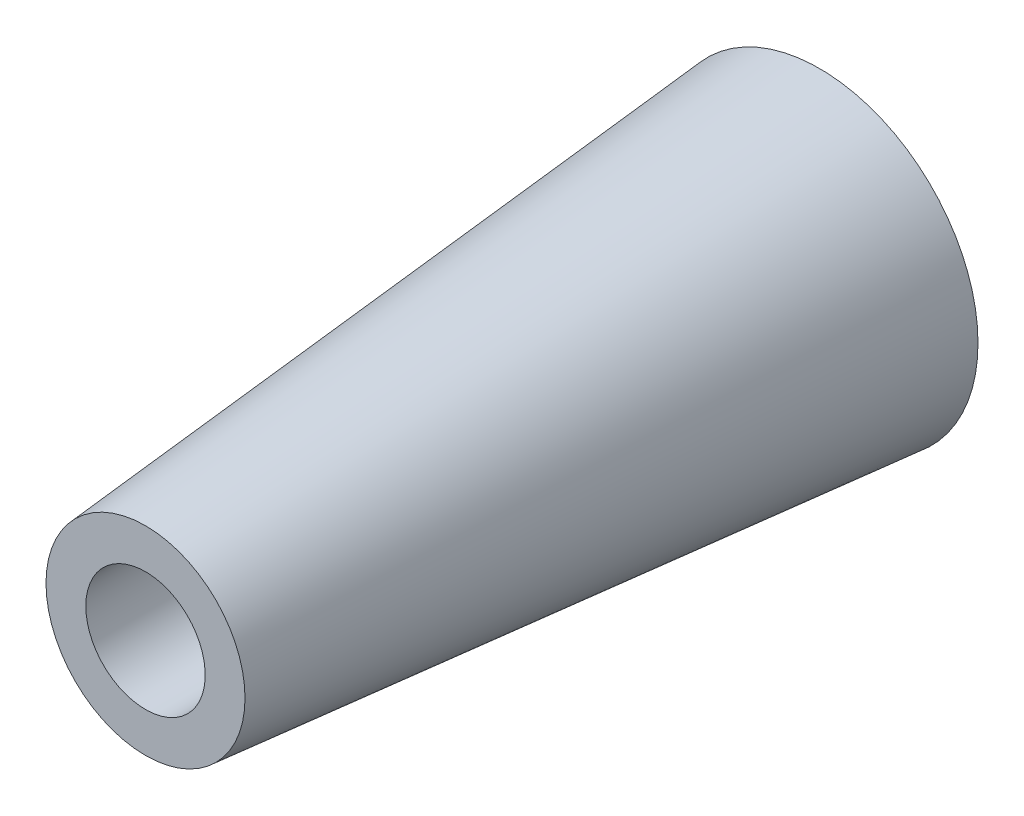
ISO-10303-21;
HEADER;
FILE_DESCRIPTION(('STEP AP214'),'2;1');
FILE_NAME('part.step','',(''),(''),'','','');
FILE_SCHEMA(('AUTOMOTIVE_DESIGN { 1 0 10303 214 1 1 1 1 }'));
ENDSEC;
DATA;
#1=APPLICATION_CONTEXT('core data for automotive mechanical design processes');
#2=APPLICATION_PROTOCOL_DEFINITION('international standard','automotive_design',2000,#1);
#3=PRODUCT_CONTEXT('',#1,'mechanical');
#4=PRODUCT('Part','Part','',(#3));
#5=PRODUCT_RELATED_PRODUCT_CATEGORY('part','',(#4));
#6=PRODUCT_DEFINITION_FORMATION('','',#4);
#7=PRODUCT_DEFINITION_CONTEXT('part definition',#1,'design');
#8=PRODUCT_DEFINITION('design','',#6,#7);
#9=PRODUCT_DEFINITION_SHAPE('','',#8);
#10=(LENGTH_UNIT() NAMED_UNIT(*) SI_UNIT(.MILLI.,.METRE.));
#11=(NAMED_UNIT(*) PLANE_ANGLE_UNIT() SI_UNIT($,.RADIAN.));
#12=(NAMED_UNIT(*) SI_UNIT($,.STERADIAN.) SOLID_ANGLE_UNIT());
#13=UNCERTAINTY_MEASURE_WITH_UNIT(LENGTH_MEASURE(1.E-05),#10,'distance_accuracy_value','');
#14=(GEOMETRIC_REPRESENTATION_CONTEXT(3) GLOBAL_UNCERTAINTY_ASSIGNED_CONTEXT((#13)) GLOBAL_UNIT_ASSIGNED_CONTEXT((#10,
#11,#12)) REPRESENTATION_CONTEXT('',''));
#15=CARTESIAN_POINT('',(0.,0.,0.));
#16=DIRECTION('',(0.,0.,1.));
#17=DIRECTION('',(1.,0.,0.));
#18=AXIS2_PLACEMENT_3D('',#15,#16,#17);
#19=CARTESIAN_POINT('',(0.,0.,50.8));
#20=DIRECTION('',(0.,0.,-1.));
#21=DIRECTION('',(1.,0.,0.));
#22=AXIS2_PLACEMENT_3D('',#19,#20,#21);
#23=CONICAL_SURFACE('',#22,7.5,0.0872664625997167);
#24=CARTESIAN_POINT('',(0.,0.,50.8));
#25=DIRECTION('',(0.,0.,1.));
#26=DIRECTION('',(1.,0.,0.));
#27=AXIS2_PLACEMENT_3D('',#24,#25,#26);
#28=CIRCLE('',#27,7.5);
#29=CARTESIAN_POINT('',(7.5,0.,50.8));
#30=VERTEX_POINT('',#29);
#31=EDGE_CURVE('E10',#30,#30,#28,.T.);
#32=ORIENTED_EDGE('',*,*,#31,.F.);
#33=EDGE_LOOP('',(#32));
#34=FACE_BOUND('',#33,.T.);
#35=CARTESIAN_POINT('',(0.,0.,0.));
#36=DIRECTION('',(0.,0.,1.));
#37=DIRECTION('',(1.,0.,0.));
#38=AXIS2_PLACEMENT_3D('',#35,#36,#37);
#39=CIRCLE('',#38,11.9444241071169);
#40=CARTESIAN_POINT('',(11.9444241071169,0.,0.));
#41=VERTEX_POINT('',#40);
#42=EDGE_CURVE('E34',#41,#41,#39,.T.);
#43=ORIENTED_EDGE('',*,*,#42,.T.);
#44=EDGE_LOOP('',(#43));
#45=FACE_BOUND('',#44,.T.);
#46=ADVANCED_FACE('F31',(#34,#45),#23,.T.);
#47=CARTESIAN_POINT('',(0.,0.,50.8));
#48=DIRECTION('',(0.,0.,1.));
#49=DIRECTION('',(1.,0.,0.));
#50=AXIS2_PLACEMENT_3D('',#47,#48,#49);
#51=PLANE('',#50);
#52=CARTESIAN_POINT('',(0.,0.,50.8));
#53=DIRECTION('',(0.,0.,-1.));
#54=DIRECTION('',(-1.,0.,0.));
#55=AXIS2_PLACEMENT_3D('',#52,#53,#54);
#56=CIRCLE('',#55,4.5);
#57=CARTESIAN_POINT('',(-4.5,0.,50.8));
#58=VERTEX_POINT('',#57);
#59=EDGE_CURVE('E41',#58,#58,#56,.T.);
#60=ORIENTED_EDGE('',*,*,#59,.T.);
#61=EDGE_LOOP('',(#60));
#62=FACE_BOUND('',#61,.T.);
#63=ORIENTED_EDGE('',*,*,#31,.T.);
#64=EDGE_LOOP('',(#63));
#65=FACE_BOUND('',#64,.T.);
#66=ADVANCED_FACE('F49',(#62,#65),#51,.T.);
#67=CARTESIAN_POINT('',(0.,0.,0.));
#68=DIRECTION('',(0.,0.,1.));
#69=DIRECTION('',(1.,0.,0.));
#70=AXIS2_PLACEMENT_3D('',#67,#68,#69);
#71=PLANE('',#70);
#72=CARTESIAN_POINT('',(0.,0.,0.));
#73=DIRECTION('',(0.,0.,-1.));
#74=DIRECTION('',(-1.,0.,0.));
#75=AXIS2_PLACEMENT_3D('',#72,#73,#74);
#76=CIRCLE('',#75,4.5);
#77=CARTESIAN_POINT('',(-4.5,0.,0.));
#78=VERTEX_POINT('',#77);
#79=EDGE_CURVE('E43',#78,#78,#76,.T.);
#80=ORIENTED_EDGE('',*,*,#79,.F.);
#81=EDGE_LOOP('',(#80));
#82=FACE_BOUND('',#81,.T.);
#83=ORIENTED_EDGE('',*,*,#42,.F.);
#84=EDGE_LOOP('',(#83));
#85=FACE_BOUND('',#84,.T.);
#86=ADVANCED_FACE('F54',(#82,#85),#71,.F.);
#87=CARTESIAN_POINT('',(0.,0.,50.8));
#88=DIRECTION('',(0.,0.,-1.));
#89=DIRECTION('',(-1.,0.,0.));
#90=AXIS2_PLACEMENT_3D('',#87,#88,#89);
#91=CYLINDRICAL_SURFACE('',#90,4.5);
#92=ORIENTED_EDGE('',*,*,#59,.F.);
#93=EDGE_LOOP('',(#92));
#94=FACE_BOUND('',#93,.T.);
#95=ORIENTED_EDGE('',*,*,#79,.T.);
#96=EDGE_LOOP('',(#95));
#97=FACE_BOUND('',#96,.T.);
#98=ADVANCED_FACE('F51',(#94,#97),#91,.F.);
#99=CLOSED_SHELL('',(#46,#66,#86,#98));
#100=MANIFOLD_SOLID_BREP('B2',#99);
#101=ADVANCED_BREP_SHAPE_REPRESENTATION('',(#18,#100),#14);
#102=SHAPE_DEFINITION_REPRESENTATION(#9,#101);
ENDSEC;
END-ISO-10303-21;
